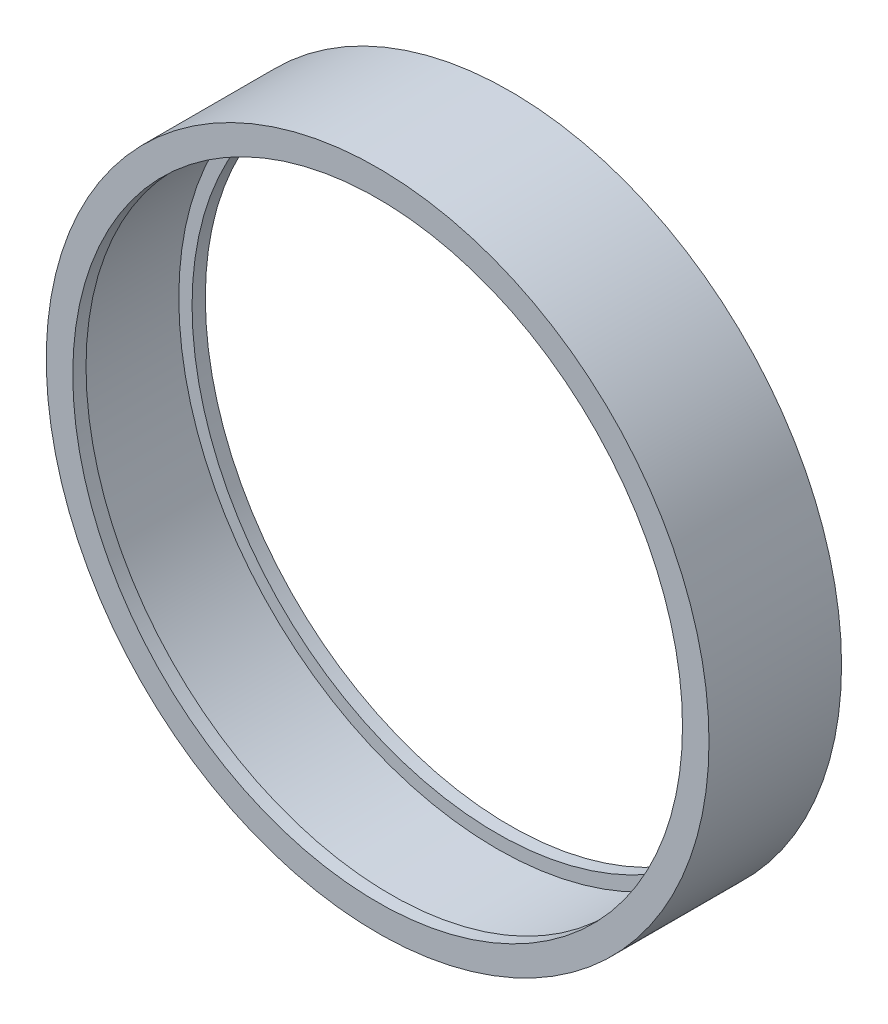
ISO-10303-21;
HEADER;
FILE_DESCRIPTION(('STEP AP214'),'2;1');
FILE_NAME('part.step','',(''),(''),'','','');
FILE_SCHEMA(('AUTOMOTIVE_DESIGN { 1 0 10303 214 1 1 1 1 }'));
ENDSEC;
DATA;
#1=APPLICATION_CONTEXT('core data for automotive mechanical design processes');
#2=APPLICATION_PROTOCOL_DEFINITION('international standard','automotive_design',2000,#1);
#3=PRODUCT_CONTEXT('',#1,'mechanical');
#4=PRODUCT('Part','Part','',(#3));
#5=PRODUCT_RELATED_PRODUCT_CATEGORY('part','',(#4));
#6=PRODUCT_DEFINITION_FORMATION('','',#4);
#7=PRODUCT_DEFINITION_CONTEXT('part definition',#1,'design');
#8=PRODUCT_DEFINITION('design','',#6,#7);
#9=PRODUCT_DEFINITION_SHAPE('','',#8);
#10=(LENGTH_UNIT() NAMED_UNIT(*) SI_UNIT(.MILLI.,.METRE.));
#11=(NAMED_UNIT(*) PLANE_ANGLE_UNIT() SI_UNIT($,.RADIAN.));
#12=(NAMED_UNIT(*) SI_UNIT($,.STERADIAN.) SOLID_ANGLE_UNIT());
#13=UNCERTAINTY_MEASURE_WITH_UNIT(LENGTH_MEASURE(1.E-05),#10,'distance_accuracy_value','');
#14=(GEOMETRIC_REPRESENTATION_CONTEXT(3) GLOBAL_UNCERTAINTY_ASSIGNED_CONTEXT((#13)) GLOBAL_UNIT_ASSIGNED_CONTEXT((#10,
#11,#12)) REPRESENTATION_CONTEXT('',''));
#15=CARTESIAN_POINT('',(0.,0.,0.));
#16=DIRECTION('',(0.,0.,1.));
#17=DIRECTION('',(1.,0.,0.));
#18=AXIS2_PLACEMENT_3D('',#15,#16,#17);
#19=CARTESIAN_POINT('',(0.,0.,20.));
#20=DIRECTION('',(0.,0.,-1.));
#21=DIRECTION('',(-1.,0.,0.));
#22=AXIS2_PLACEMENT_3D('',#19,#20,#21);
#23=CYLINDRICAL_SURFACE('',#22,46.);
#24=CARTESIAN_POINT('',(0.,0.,20.));
#25=DIRECTION('',(0.,0.,-1.));
#26=DIRECTION('',(-1.,0.,0.));
#27=AXIS2_PLACEMENT_3D('',#24,#25,#26);
#28=CIRCLE('',#27,46.);
#29=CARTESIAN_POINT('',(-46.,0.,20.));
#30=VERTEX_POINT('',#29);
#31=EDGE_CURVE('E50',#30,#30,#28,.T.);
#32=ORIENTED_EDGE('',*,*,#31,.F.);
#33=EDGE_LOOP('',(#32));
#34=FACE_BOUND('',#33,.T.);
#35=CARTESIAN_POINT('',(0.,0.,18.));
#36=DIRECTION('',(0.,0.,-1.));
#37=DIRECTION('',(-1.,0.,0.));
#38=AXIS2_PLACEMENT_3D('',#35,#36,#37);
#39=CIRCLE('',#38,46.);
#40=CARTESIAN_POINT('',(-46.,0.,18.));
#41=VERTEX_POINT('',#40);
#42=EDGE_CURVE('E38',#41,#41,#39,.F.);
#43=ORIENTED_EDGE('',*,*,#42,.F.);
#44=EDGE_LOOP('',(#43));
#45=FACE_BOUND('',#44,.T.);
#46=ADVANCED_FACE('F34',(#34,#45),#23,.F.);
#47=CARTESIAN_POINT('',(0.,0.,20.));
#48=DIRECTION('',(0.,0.,-1.));
#49=DIRECTION('',(-1.,0.,0.));
#50=AXIS2_PLACEMENT_3D('',#47,#48,#49);
#51=CYLINDRICAL_SURFACE('',#50,50.);
#52=CARTESIAN_POINT('',(0.,0.,20.));
#53=DIRECTION('',(0.,0.,1.));
#54=DIRECTION('',(1.,0.,0.));
#55=AXIS2_PLACEMENT_3D('',#52,#53,#54);
#56=CIRCLE('',#55,50.);
#57=CARTESIAN_POINT('',(50.,0.,20.));
#58=VERTEX_POINT('',#57);
#59=EDGE_CURVE('E10',#58,#58,#56,.T.);
#60=ORIENTED_EDGE('',*,*,#59,.F.);
#61=EDGE_LOOP('',(#60));
#62=FACE_BOUND('',#61,.T.);
#63=CARTESIAN_POINT('',(0.,0.,0.));
#64=DIRECTION('',(0.,0.,1.));
#65=DIRECTION('',(1.,0.,0.));
#66=AXIS2_PLACEMENT_3D('',#63,#64,#65);
#67=CIRCLE('',#66,50.);
#68=CARTESIAN_POINT('',(50.,0.,0.));
#69=VERTEX_POINT('',#68);
#70=EDGE_CURVE('E42',#69,#69,#67,.T.);
#71=ORIENTED_EDGE('',*,*,#70,.T.);
#72=EDGE_LOOP('',(#71));
#73=FACE_BOUND('',#72,.T.);
#74=ADVANCED_FACE('F36',(#62,#73),#51,.T.);
#75=CARTESIAN_POINT('',(0.,0.,20.));
#76=DIRECTION('',(0.,0.,1.));
#77=DIRECTION('',(1.,0.,0.));
#78=AXIS2_PLACEMENT_3D('',#75,#76,#77);
#79=PLANE('',#78);
#80=ORIENTED_EDGE('',*,*,#31,.T.);
#81=EDGE_LOOP('',(#80));
#82=FACE_BOUND('',#81,.T.);
#83=ORIENTED_EDGE('',*,*,#59,.T.);
#84=EDGE_LOOP('',(#83));
#85=FACE_BOUND('',#84,.T.);
#86=ADVANCED_FACE('F89',(#82,#85),#79,.T.);
#87=CARTESIAN_POINT('',(0.,0.,0.));
#88=DIRECTION('',(0.,0.,1.));
#89=DIRECTION('',(1.,0.,0.));
#90=AXIS2_PLACEMENT_3D('',#87,#88,#89);
#91=PLANE('',#90);
#92=CARTESIAN_POINT('',(0.,0.,0.));
#93=DIRECTION('',(0.,0.,1.));
#94=DIRECTION('',(1.,0.,0.));
#95=AXIS2_PLACEMENT_3D('',#92,#93,#94);
#96=CIRCLE('',#95,46.);
#97=CARTESIAN_POINT('',(46.,0.,0.));
#98=VERTEX_POINT('',#97);
#99=EDGE_CURVE('E47',#98,#98,#96,.T.);
#100=ORIENTED_EDGE('',*,*,#99,.T.);
#101=EDGE_LOOP('',(#100));
#102=FACE_BOUND('',#101,.T.);
#103=ORIENTED_EDGE('',*,*,#70,.F.);
#104=EDGE_LOOP('',(#103));
#105=FACE_BOUND('',#104,.T.);
#106=ADVANCED_FACE('F95',(#102,#105),#91,.F.);
#107=CARTESIAN_POINT('',(0.,0.,2.));
#108=DIRECTION('',(0.,0.,-1.));
#109=DIRECTION('',(-1.,0.,0.));
#110=AXIS2_PLACEMENT_3D('',#107,#108,#109);
#111=CIRCLE('',#110,46.);
#112=CARTESIAN_POINT('',(-46.,0.,2.));
#113=VERTEX_POINT('',#112);
#114=EDGE_CURVE('E54',#113,#113,#111,.F.);
#115=ORIENTED_EDGE('',*,*,#114,.T.);
#116=EDGE_LOOP('',(#115));
#117=FACE_BOUND('',#116,.T.);
#118=ORIENTED_EDGE('',*,*,#99,.F.);
#119=EDGE_LOOP('',(#118));
#120=FACE_BOUND('',#119,.T.);
#121=ADVANCED_FACE('F81',(#117,#120),#23,.F.);
#122=CARTESIAN_POINT('',(0.,0.,18.));
#123=DIRECTION('',(0.,0.,-1.));
#124=DIRECTION('',(-1.,0.,0.));
#125=AXIS2_PLACEMENT_3D('',#122,#123,#124);
#126=PLANE('',#125);
#127=CARTESIAN_POINT('',(0.,0.,18.));
#128=DIRECTION('',(0.,0.,-1.));
#129=DIRECTION('',(-1.,0.,0.));
#130=AXIS2_PLACEMENT_3D('',#127,#128,#129);
#131=CIRCLE('',#130,48.);
#132=CARTESIAN_POINT('',(-48.,0.,18.));
#133=VERTEX_POINT('',#132);
#134=EDGE_CURVE('E56',#133,#133,#131,.T.);
#135=ORIENTED_EDGE('',*,*,#134,.T.);
#136=EDGE_LOOP('',(#135));
#137=FACE_BOUND('',#136,.T.);
#138=ORIENTED_EDGE('',*,*,#42,.T.);
#139=EDGE_LOOP('',(#138));
#140=FACE_BOUND('',#139,.T.);
#141=ADVANCED_FACE('F73',(#137,#140),#126,.T.);
#142=CARTESIAN_POINT('',(0.,0.,2.));
#143=DIRECTION('',(0.,0.,-1.));
#144=DIRECTION('',(-1.,0.,0.));
#145=AXIS2_PLACEMENT_3D('',#142,#143,#144);
#146=PLANE('',#145);
#147=CARTESIAN_POINT('',(0.,0.,2.));
#148=DIRECTION('',(0.,0.,-1.));
#149=DIRECTION('',(-1.,0.,0.));
#150=AXIS2_PLACEMENT_3D('',#147,#148,#149);
#151=CIRCLE('',#150,48.);
#152=CARTESIAN_POINT('',(-48.,0.,2.));
#153=VERTEX_POINT('',#152);
#154=EDGE_CURVE('E61',#153,#153,#151,.T.);
#155=ORIENTED_EDGE('',*,*,#154,.F.);
#156=EDGE_LOOP('',(#155));
#157=FACE_BOUND('',#156,.T.);
#158=ORIENTED_EDGE('',*,*,#114,.F.);
#159=EDGE_LOOP('',(#158));
#160=FACE_BOUND('',#159,.T.);
#161=ADVANCED_FACE('F70',(#157,#160),#146,.F.);
#162=CARTESIAN_POINT('',(0.,0.,18.));
#163=DIRECTION('',(0.,0.,-1.));
#164=DIRECTION('',(-1.,0.,0.));
#165=AXIS2_PLACEMENT_3D('',#162,#163,#164);
#166=CYLINDRICAL_SURFACE('',#165,48.);
#167=ORIENTED_EDGE('',*,*,#134,.F.);
#168=EDGE_LOOP('',(#167));
#169=FACE_BOUND('',#168,.T.);
#170=ORIENTED_EDGE('',*,*,#154,.T.);
#171=EDGE_LOOP('',(#170));
#172=FACE_BOUND('',#171,.T.);
#173=ADVANCED_FACE('F68',(#169,#172),#166,.F.);
#174=CLOSED_SHELL('',(#46,#74,#86,#106,#121,#141,#161,#173));
#175=MANIFOLD_SOLID_BREP('B2',#174);
#176=ADVANCED_BREP_SHAPE_REPRESENTATION('',(#18,#175),#14);
#177=SHAPE_DEFINITION_REPRESENTATION(#9,#176);
ENDSEC;
END-ISO-10303-21;
